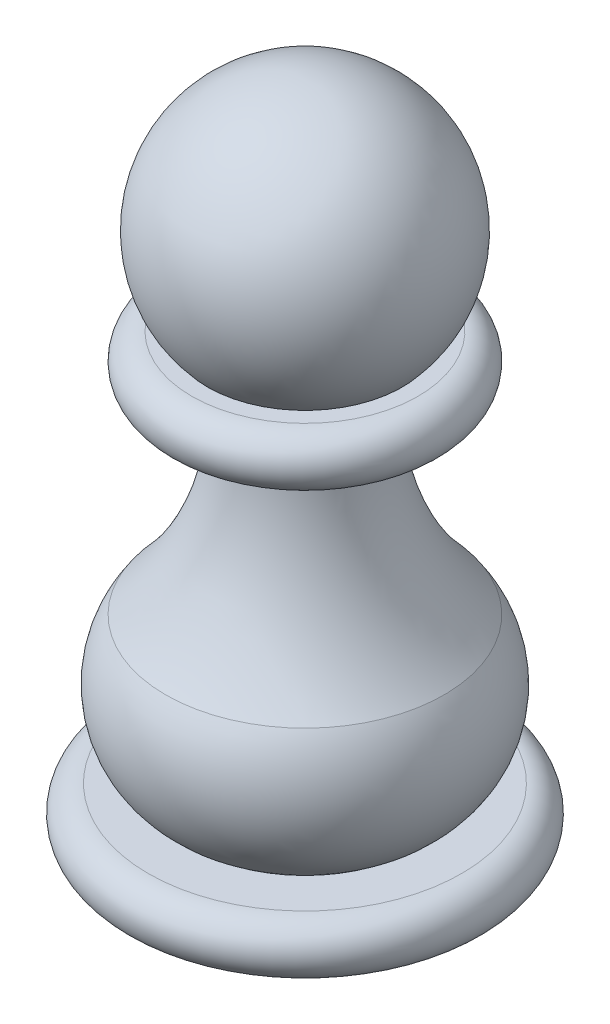
ISO-10303-21;
HEADER;
FILE_DESCRIPTION(('STEP AP214'),'2;1');
FILE_NAME('part.step','',(''),(''),'','','');
FILE_SCHEMA(('AUTOMOTIVE_DESIGN { 1 0 10303 214 1 1 1 1 }'));
ENDSEC;
DATA;
#1=APPLICATION_CONTEXT('core data for automotive mechanical design processes');
#2=APPLICATION_PROTOCOL_DEFINITION('international standard','automotive_design',2000,#1);
#3=PRODUCT_CONTEXT('',#1,'mechanical');
#4=PRODUCT('Part','Part','',(#3));
#5=PRODUCT_RELATED_PRODUCT_CATEGORY('part','',(#4));
#6=PRODUCT_DEFINITION_FORMATION('','',#4);
#7=PRODUCT_DEFINITION_CONTEXT('part definition',#1,'design');
#8=PRODUCT_DEFINITION('design','',#6,#7);
#9=PRODUCT_DEFINITION_SHAPE('','',#8);
#10=(LENGTH_UNIT() NAMED_UNIT(*) SI_UNIT(.MILLI.,.METRE.));
#11=(NAMED_UNIT(*) PLANE_ANGLE_UNIT() SI_UNIT($,.RADIAN.));
#12=(NAMED_UNIT(*) SI_UNIT($,.STERADIAN.) SOLID_ANGLE_UNIT());
#13=UNCERTAINTY_MEASURE_WITH_UNIT(LENGTH_MEASURE(1.E-05),#10,'distance_accuracy_value','');
#14=(GEOMETRIC_REPRESENTATION_CONTEXT(3) GLOBAL_UNCERTAINTY_ASSIGNED_CONTEXT((#13)) GLOBAL_UNIT_ASSIGNED_CONTEXT((#10,
#11,#12)) REPRESENTATION_CONTEXT('',''));
#15=CARTESIAN_POINT('',(0.,0.,0.));
#16=DIRECTION('',(0.,0.,1.));
#17=DIRECTION('',(1.,0.,0.));
#18=AXIS2_PLACEMENT_3D('',#15,#16,#17);
#19=CARTESIAN_POINT('',(0.,-7.5,0.));
#20=DIRECTION('',(0.,1.,0.));
#21=DIRECTION('',(-1.,0.,0.));
#22=AXIS2_PLACEMENT_3D('',#19,#20,#21);
#23=SPHERICAL_SURFACE('',#22,7.5);
#24=CARTESIAN_POINT('',(0.,-12.5,0.));
#25=DIRECTION('',(0.,1.,0.));
#26=DIRECTION('',(0.,0.,1.));
#27=AXIS2_PLACEMENT_3D('',#24,#25,#26);
#28=CIRCLE('',#27,5.59016994374947);
#29=CARTESIAN_POINT('',(0.,-12.5,5.59016994374947));
#30=VERTEX_POINT('',#29);
#31=EDGE_CURVE('E10',#30,#30,#28,.T.);
#32=ORIENTED_EDGE('',*,*,#31,.T.);
#33=EDGE_LOOP('',(#32));
#34=FACE_BOUND('',#33,.T.);
#35=ADVANCED_FACE('F38',(#34),#23,.T.);
#36=CARTESIAN_POINT('',(0.,-12.5,0.));
#37=DIRECTION('',(0.,1.,0.));
#38=DIRECTION('',(0.,0.,1.));
#39=AXIS2_PLACEMENT_3D('',#36,#37,#38);
#40=PLANE('',#39);
#41=CARTESIAN_POINT('',(0.,-12.5,0.));
#42=DIRECTION('',(0.,1.,0.));
#43=DIRECTION('',(0.,0.,1.));
#44=AXIS2_PLACEMENT_3D('',#41,#42,#43);
#45=CIRCLE('',#44,6.5);
#46=CARTESIAN_POINT('',(0.,-12.5,6.5));
#47=VERTEX_POINT('',#46);
#48=EDGE_CURVE('E45',#47,#47,#45,.T.);
#49=ORIENTED_EDGE('',*,*,#48,.T.);
#50=EDGE_LOOP('',(#49));
#51=FACE_BOUND('',#50,.T.);
#52=ORIENTED_EDGE('',*,*,#31,.F.);
#53=EDGE_LOOP('',(#52));
#54=FACE_BOUND('',#53,.T.);
#55=ADVANCED_FACE('F79',(#51,#54),#40,.T.);
#56=CARTESIAN_POINT('',(0.,-14.,0.));
#57=DIRECTION('',(0.,1.,0.));
#58=DIRECTION('',(0.,0.,1.));
#59=AXIS2_PLACEMENT_3D('',#56,#57,#58);
#60=TOROIDAL_SURFACE('',#59,6.5,1.5);
#61=ORIENTED_EDGE('',*,*,#48,.F.);
#62=EDGE_LOOP('',(#61));
#63=FACE_BOUND('',#62,.T.);
#64=CARTESIAN_POINT('',(0.,-15.5,0.));
#65=DIRECTION('',(0.,1.,0.));
#66=DIRECTION('',(0.,0.,1.));
#67=AXIS2_PLACEMENT_3D('',#64,#65,#66);
#68=CIRCLE('',#67,6.5);
#69=CARTESIAN_POINT('',(0.,-15.5,6.5));
#70=VERTEX_POINT('',#69);
#71=EDGE_CURVE('E46',#70,#70,#68,.T.);
#72=ORIENTED_EDGE('',*,*,#71,.T.);
#73=EDGE_LOOP('',(#72));
#74=FACE_BOUND('',#73,.T.);
#75=ADVANCED_FACE('F85',(#63,#74),#60,.T.);
#76=CARTESIAN_POINT('',(0.,-15.5,0.));
#77=DIRECTION('',(0.,1.,0.));
#78=DIRECTION('',(0.,0.,1.));
#79=AXIS2_PLACEMENT_3D('',#76,#77,#78);
#80=PLANE('',#79);
#81=ORIENTED_EDGE('',*,*,#71,.F.);
#82=EDGE_LOOP('',(#81));
#83=FACE_BOUND('',#82,.T.);
#84=CARTESIAN_POINT('',(0.,-15.5,0.));
#85=DIRECTION('',(0.,1.,0.));
#86=DIRECTION('',(0.,0.,1.));
#87=AXIS2_PLACEMENT_3D('',#84,#85,#86);
#88=CIRCLE('',#87,4.);
#89=CARTESIAN_POINT('',(0.,-15.5,4.));
#90=VERTEX_POINT('',#89);
#91=EDGE_CURVE('E49',#90,#90,#88,.T.);
#92=ORIENTED_EDGE('',*,*,#91,.T.);
#93=EDGE_LOOP('',(#92));
#94=FACE_BOUND('',#93,.T.);
#95=ADVANCED_FACE('F86',(#83,#94),#80,.F.);
#96=CARTESIAN_POINT('',(0.,-16.381247286278,0.));
#97=DIRECTION('',(0.,1.,0.));
#98=DIRECTION('',(0.,0.,1.));
#99=AXIS2_PLACEMENT_3D('',#96,#97,#98);
#100=TOROIDAL_SURFACE('',#99,18.974091064917,15.);
#101=ORIENTED_EDGE('',*,*,#91,.F.);
#102=EDGE_LOOP('',(#101));
#103=FACE_BOUND('',#102,.T.);
#104=CARTESIAN_POINT('',(0.,-26.6071616854361,0.));
#105=DIRECTION('',(0.,1.,0.));
#106=DIRECTION('',(0.,0.,1.));
#107=AXIS2_PLACEMENT_3D('',#104,#105,#106);
#108=CIRCLE('',#107,8.);
#109=CARTESIAN_POINT('',(0.,-26.6071616854361,8.));
#110=VERTEX_POINT('',#109);
#111=EDGE_CURVE('E54',#110,#110,#108,.T.);
#112=ORIENTED_EDGE('',*,*,#111,.T.);
#113=EDGE_LOOP('',(#112));
#114=FACE_BOUND('',#113,.T.);
#115=ADVANCED_FACE('F94',(#103,#114),#100,.F.);
#116=CARTESIAN_POINT('',(0.,-30.0607314957069,0.));
#117=DIRECTION('',(0.,1.,0.));
#118=DIRECTION('',(0.,0.,1.));
#119=AXIS2_PLACEMENT_3D('',#116,#117,#118);
#120=DEGENERATE_TOROIDAL_SURFACE('',#119,3.0935903589706,6.,.T.);
#121=CARTESIAN_POINT('',(0.,-35.,0.));
#122=DIRECTION('',(0.,1.,0.));
#123=DIRECTION('',(0.,0.,1.));
#124=AXIS2_PLACEMENT_3D('',#121,#122,#123);
#125=CIRCLE('',#124,6.49999999999998);
#126=CARTESIAN_POINT('',(0.,-35.,6.49999999999998));
#127=VERTEX_POINT('',#126);
#128=EDGE_CURVE('E59',#127,#127,#125,.T.);
#129=ORIENTED_EDGE('',*,*,#128,.T.);
#130=EDGE_LOOP('',(#129));
#131=FACE_BOUND('',#130,.T.);
#132=ORIENTED_EDGE('',*,*,#111,.F.);
#133=EDGE_LOOP('',(#132));
#134=FACE_BOUND('',#133,.T.);
#135=ADVANCED_FACE('F97',(#131,#134),#120,.T.);
#136=CARTESIAN_POINT('',(0.,-35.,0.));
#137=DIRECTION('',(0.,1.,0.));
#138=DIRECTION('',(0.,0.,1.));
#139=AXIS2_PLACEMENT_3D('',#136,#137,#138);
#140=PLANE('',#139);
#141=CARTESIAN_POINT('',(0.,-35.,0.));
#142=DIRECTION('',(0.,1.,0.));
#143=DIRECTION('',(0.,0.,1.));
#144=AXIS2_PLACEMENT_3D('',#141,#142,#143);
#145=CIRCLE('',#144,8.99999999999999);
#146=CARTESIAN_POINT('',(0.,-35.,8.99999999999999));
#147=VERTEX_POINT('',#146);
#148=EDGE_CURVE('E62',#147,#147,#145,.T.);
#149=ORIENTED_EDGE('',*,*,#148,.T.);
#150=EDGE_LOOP('',(#149));
#151=FACE_BOUND('',#150,.T.);
#152=ORIENTED_EDGE('',*,*,#128,.F.);
#153=EDGE_LOOP('',(#152));
#154=FACE_BOUND('',#153,.T.);
#155=ADVANCED_FACE('F78',(#151,#154),#140,.T.);
#156=CARTESIAN_POINT('',(0.,-36.5,0.));
#157=DIRECTION('',(0.,1.,0.));
#158=DIRECTION('',(0.,0.,1.));
#159=AXIS2_PLACEMENT_3D('',#156,#157,#158);
#160=TOROIDAL_SURFACE('',#159,8.99999999999999,1.49999999999999);
#161=ORIENTED_EDGE('',*,*,#148,.F.);
#162=EDGE_LOOP('',(#161));
#163=FACE_BOUND('',#162,.T.);
#164=CARTESIAN_POINT('',(0.,-38.,0.));
#165=DIRECTION('',(0.,1.,0.));
#166=DIRECTION('',(0.,0.,1.));
#167=AXIS2_PLACEMENT_3D('',#164,#165,#166);
#168=CIRCLE('',#167,8.99999999999999);
#169=CARTESIAN_POINT('',(0.,-38.,8.99999999999999));
#170=VERTEX_POINT('',#169);
#171=EDGE_CURVE('E61',#170,#170,#168,.T.);
#172=ORIENTED_EDGE('',*,*,#171,.T.);
#173=EDGE_LOOP('',(#172));
#174=FACE_BOUND('',#173,.T.);
#175=ADVANCED_FACE('F68',(#163,#174),#160,.T.);
#176=CARTESIAN_POINT('',(0.,-38.,0.));
#177=DIRECTION('',(0.,1.,0.));
#178=DIRECTION('',(0.,0.,1.));
#179=AXIS2_PLACEMENT_3D('',#176,#177,#178);
#180=PLANE('',#179);
#181=ORIENTED_EDGE('',*,*,#171,.F.);
#182=EDGE_LOOP('',(#181));
#183=FACE_BOUND('',#182,.T.);
#184=ADVANCED_FACE('F69',(#183),#180,.F.);
#185=CLOSED_SHELL('',(#35,#55,#75,#95,#115,#135,#155,#175,#184));
#186=MANIFOLD_SOLID_BREP('B2',#185);
#187=ADVANCED_BREP_SHAPE_REPRESENTATION('',(#18,#186),#14);
#188=SHAPE_DEFINITION_REPRESENTATION(#9,#187);
ENDSEC;
END-ISO-10303-21;
